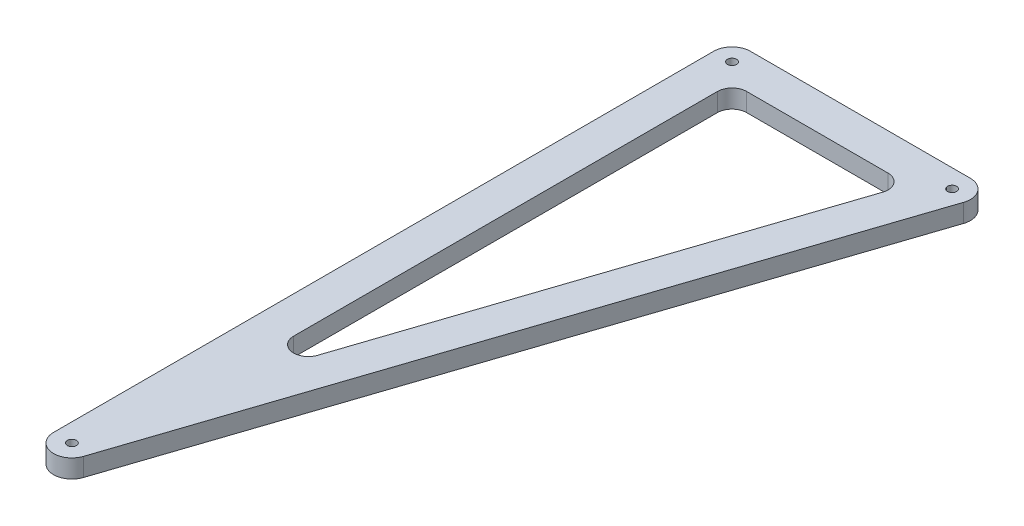
ISO-10303-21;
HEADER;
FILE_DESCRIPTION(('STEP AP214'),'2;1');
FILE_NAME('part.step','',(''),(''),'','','');
FILE_SCHEMA(('AUTOMOTIVE_DESIGN { 1 0 10303 214 1 1 1 1 }'));
ENDSEC;
DATA;
#1=APPLICATION_CONTEXT('core data for automotive mechanical design processes');
#2=APPLICATION_PROTOCOL_DEFINITION('international standard','automotive_design',2000,#1);
#3=PRODUCT_CONTEXT('',#1,'mechanical');
#4=PRODUCT('Part','Part','',(#3));
#5=PRODUCT_RELATED_PRODUCT_CATEGORY('part','',(#4));
#6=PRODUCT_DEFINITION_FORMATION('','',#4);
#7=PRODUCT_DEFINITION_CONTEXT('part definition',#1,'design');
#8=PRODUCT_DEFINITION('design','',#6,#7);
#9=PRODUCT_DEFINITION_SHAPE('','',#8);
#10=(LENGTH_UNIT() NAMED_UNIT(*) SI_UNIT(.MILLI.,.METRE.));
#11=(NAMED_UNIT(*) PLANE_ANGLE_UNIT() SI_UNIT($,.RADIAN.));
#12=(NAMED_UNIT(*) SI_UNIT($,.STERADIAN.) SOLID_ANGLE_UNIT());
#13=UNCERTAINTY_MEASURE_WITH_UNIT(LENGTH_MEASURE(1.E-05),#10,'distance_accuracy_value','');
#14=(GEOMETRIC_REPRESENTATION_CONTEXT(3) GLOBAL_UNCERTAINTY_ASSIGNED_CONTEXT((#13)) GLOBAL_UNIT_ASSIGNED_CONTEXT((#10,
#11,#12)) REPRESENTATION_CONTEXT('',''));
#15=CARTESIAN_POINT('',(0.,0.,0.));
#16=DIRECTION('',(0.,0.,1.));
#17=DIRECTION('',(1.,0.,0.));
#18=AXIS2_PLACEMENT_3D('',#15,#16,#17);
#19=CARTESIAN_POINT('',(0.,3.175,0.));
#20=DIRECTION('',(0.,-1.,0.));
#21=DIRECTION('',(0.,0.,-1.));
#22=AXIS2_PLACEMENT_3D('',#19,#20,#21);
#23=PLANE('',#22);
#24=CARTESIAN_POINT('',(0.,3.175,0.));
#25=DIRECTION('',(0.,1.,0.));
#26=DIRECTION('',(0.,0.,1.));
#27=AXIS2_PLACEMENT_3D('',#24,#25,#26);
#28=CIRCLE('',#27,0.7874);
#29=CARTESIAN_POINT('',(0.,3.175,0.7874));
#30=VERTEX_POINT('',#29);
#31=EDGE_CURVE('E204',#30,#30,#28,.T.);
#32=ORIENTED_EDGE('',*,*,#31,.F.);
#33=EDGE_LOOP('',(#32));
#34=FACE_BOUND('',#33,.T.);
#35=CARTESIAN_POINT('',(38.1,3.175,-114.3));
#36=DIRECTION('',(0.,1.,0.));
#37=DIRECTION('',(0.,0.,1.));
#38=AXIS2_PLACEMENT_3D('',#35,#36,#37);
#39=CIRCLE('',#38,0.787399999999999);
#40=CARTESIAN_POINT('',(38.1,3.175,-113.5126));
#41=VERTEX_POINT('',#40);
#42=EDGE_CURVE('E212',#41,#41,#39,.T.);
#43=ORIENTED_EDGE('',*,*,#42,.F.);
#44=EDGE_LOOP('',(#43));
#45=FACE_BOUND('',#44,.T.);
#46=CARTESIAN_POINT('',(0.,3.175,-114.3));
#47=DIRECTION('',(0.,1.,0.));
#48=DIRECTION('',(0.,0.,1.));
#49=AXIS2_PLACEMENT_3D('',#46,#47,#48);
#50=CIRCLE('',#49,0.7874);
#51=CARTESIAN_POINT('',(0.,3.175,-113.5126));
#52=VERTEX_POINT('',#51);
#53=EDGE_CURVE('E220',#52,#52,#50,.T.);
#54=ORIENTED_EDGE('',*,*,#53,.F.);
#55=EDGE_LOOP('',(#54));
#56=FACE_BOUND('',#55,.T.);
#57=CARTESIAN_POINT('',(0.,3.175,0.));
#58=DIRECTION('',(0.,1.,0.));
#59=DIRECTION('',(0.,0.,-1.));
#60=AXIS2_PLACEMENT_3D('',#57,#58,#59);
#61=CIRCLE('',#60,3.175);
#62=CARTESIAN_POINT('',(-3.175,3.175,0.));
#63=VERTEX_POINT('',#62);
#64=CARTESIAN_POINT('',(3.01206947131038,3.175,1.00402315710346));
#65=VERTEX_POINT('',#64);
#66=EDGE_CURVE('E228',#63,#65,#61,.T.);
#67=ORIENTED_EDGE('',*,*,#66,.T.);
#68=DIRECTION('',(0.316227766016838,0.,-0.948683298050514));
#69=VECTOR('',#68,1.);
#70=CARTESIAN_POINT('',(41.1120694713104,3.175,-113.295976842897));
#71=LINE('',#70,#69);
#72=CARTESIAN_POINT('',(41.1120694713104,3.175,-113.295976842897));
#73=VERTEX_POINT('',#72);
#74=EDGE_CURVE('E232',#65,#73,#71,.T.);
#75=ORIENTED_EDGE('',*,*,#74,.T.);
#76=CARTESIAN_POINT('',(38.1,3.175,-114.3));
#77=DIRECTION('',(0.,1.,0.));
#78=DIRECTION('',(0.,0.,-1.));
#79=AXIS2_PLACEMENT_3D('',#76,#77,#78);
#80=CIRCLE('',#79,3.17499999999999);
#81=CARTESIAN_POINT('',(38.1,3.175,-117.475));
#82=VERTEX_POINT('',#81);
#83=EDGE_CURVE('E236',#73,#82,#80,.T.);
#84=ORIENTED_EDGE('',*,*,#83,.T.);
#85=DIRECTION('',(-1.,0.,0.));
#86=VECTOR('',#85,1.);
#87=CARTESIAN_POINT('',(0.,3.175,-117.475));
#88=LINE('',#87,#86);
#89=CARTESIAN_POINT('',(0.,3.175,-117.475));
#90=VERTEX_POINT('',#89);
#91=EDGE_CURVE('E239',#82,#90,#88,.T.);
#92=ORIENTED_EDGE('',*,*,#91,.T.);
#93=CARTESIAN_POINT('',(0.,3.175,-114.3));
#94=DIRECTION('',(0.,1.,0.));
#95=DIRECTION('',(0.,0.,-1.));
#96=AXIS2_PLACEMENT_3D('',#93,#94,#95);
#97=CIRCLE('',#96,3.175);
#98=CARTESIAN_POINT('',(-3.175,3.175,-114.3));
#99=VERTEX_POINT('',#98);
#100=EDGE_CURVE('E242',#90,#99,#97,.T.);
#101=ORIENTED_EDGE('',*,*,#100,.T.);
#102=DIRECTION('',(0.,0.,1.));
#103=VECTOR('',#102,1.);
#104=CARTESIAN_POINT('',(-3.175,3.175,0.));
#105=LINE('',#104,#103);
#106=EDGE_CURVE('E245',#99,#63,#105,.T.);
#107=ORIENTED_EDGE('',*,*,#106,.T.);
#108=EDGE_LOOP('',(#67,#75,#84,#92,#101,#107));
#109=FACE_BOUND('',#108,.T.);
#110=CARTESIAN_POINT('',(30.1708610573792,3.175,-108.585));
#111=DIRECTION('',(0.,1.,0.));
#112=DIRECTION('',(0.,0.,-1.));
#113=AXIS2_PLACEMENT_3D('',#110,#111,#112);
#114=CIRCLE('',#113,2.54);
#115=CARTESIAN_POINT('',(32.5805166344275,3.175,-107.781781474317));
#116=VERTEX_POINT('',#115);
#117=CARTESIAN_POINT('',(30.1708610573792,3.175,-111.125));
#118=VERTEX_POINT('',#117);
#119=EDGE_CURVE('E135',#116,#118,#114,.T.);
#120=ORIENTED_EDGE('',*,*,#119,.F.);
#121=DIRECTION('',(0.316227766016838,0.,-0.948683298050514));
#122=VECTOR('',#121,1.);
#123=CARTESIAN_POINT('',(8.12465557704831,3.175,-34.4141983021795));
#124=LINE('',#123,#122);
#125=CARTESIAN_POINT('',(8.12465557704831,3.175,-34.4141983021795));
#126=VERTEX_POINT('',#125);
#127=EDGE_CURVE('E170',#126,#116,#124,.T.);
#128=ORIENTED_EDGE('',*,*,#127,.F.);
#129=CARTESIAN_POINT('',(5.71500000000001,3.175,-35.2174168278623));
#130=DIRECTION('',(0.,1.,0.));
#131=DIRECTION('',(0.,0.,1.));
#132=AXIS2_PLACEMENT_3D('',#129,#130,#131);
#133=CIRCLE('',#132,2.54);
#134=CARTESIAN_POINT('',(3.17500000000001,3.175,-35.2174168278623));
#135=VERTEX_POINT('',#134);
#136=EDGE_CURVE('E167',#135,#126,#133,.T.);
#137=ORIENTED_EDGE('',*,*,#136,.F.);
#138=DIRECTION('',(0.,0.,1.));
#139=VECTOR('',#138,1.);
#140=CARTESIAN_POINT('',(3.175,3.175,-108.585));
#141=LINE('',#140,#139);
#142=CARTESIAN_POINT('',(3.175,3.175,-108.585));
#143=VERTEX_POINT('',#142);
#144=EDGE_CURVE('E162',#143,#135,#141,.T.);
#145=ORIENTED_EDGE('',*,*,#144,.F.);
#146=CARTESIAN_POINT('',(5.715,3.175,-108.585));
#147=DIRECTION('',(0.,1.,0.));
#148=DIRECTION('',(0.,0.,1.));
#149=AXIS2_PLACEMENT_3D('',#146,#147,#148);
#150=CIRCLE('',#149,2.54);
#151=CARTESIAN_POINT('',(5.715,3.175,-111.125));
#152=VERTEX_POINT('',#151);
#153=EDGE_CURVE('E158',#152,#143,#150,.T.);
#154=ORIENTED_EDGE('',*,*,#153,.F.);
#155=DIRECTION('',(-1.,0.,0.));
#156=VECTOR('',#155,1.);
#157=CARTESIAN_POINT('',(30.1708610573792,3.175,-111.125));
#158=LINE('',#157,#156);
#159=EDGE_CURVE('E144',#118,#152,#158,.T.);
#160=ORIENTED_EDGE('',*,*,#159,.F.);
#161=EDGE_LOOP('',(#120,#128,#137,#145,#154,#160));
#162=FACE_BOUND('',#161,.T.);
#163=ADVANCED_FACE('F45',(#34,#45,#56,#109,#162),#23,.F.);
#164=CARTESIAN_POINT('',(0.,0.,0.));
#165=DIRECTION('',(0.,-1.,0.));
#166=DIRECTION('',(0.,0.,-1.));
#167=AXIS2_PLACEMENT_3D('',#164,#165,#166);
#168=PLANE('',#167);
#169=CARTESIAN_POINT('',(38.1,0.,-114.3));
#170=DIRECTION('',(0.,1.,0.));
#171=DIRECTION('',(0.,0.,1.));
#172=AXIS2_PLACEMENT_3D('',#169,#170,#171);
#173=CIRCLE('',#172,0.787399999999999);
#174=CARTESIAN_POINT('',(38.1,0.,-113.5126));
#175=VERTEX_POINT('',#174);
#176=EDGE_CURVE('E208',#175,#175,#173,.T.);
#177=ORIENTED_EDGE('',*,*,#176,.T.);
#178=EDGE_LOOP('',(#177));
#179=FACE_BOUND('',#178,.T.);
#180=CARTESIAN_POINT('',(0.,0.,0.));
#181=DIRECTION('',(0.,1.,0.));
#182=DIRECTION('',(0.,0.,-1.));
#183=AXIS2_PLACEMENT_3D('',#180,#181,#182);
#184=CIRCLE('',#183,3.175);
#185=CARTESIAN_POINT('',(-3.175,0.,0.));
#186=VERTEX_POINT('',#185);
#187=CARTESIAN_POINT('',(3.01206947131038,0.,1.00402315710346));
#188=VERTEX_POINT('',#187);
#189=EDGE_CURVE('E224',#186,#188,#184,.T.);
#190=ORIENTED_EDGE('',*,*,#189,.F.);
#191=DIRECTION('',(0.,0.,1.));
#192=VECTOR('',#191,1.);
#193=CARTESIAN_POINT('',(-3.175,0.,0.));
#194=LINE('',#193,#192);
#195=CARTESIAN_POINT('',(-3.175,0.,-114.3));
#196=VERTEX_POINT('',#195);
#197=EDGE_CURVE('E233',#196,#186,#194,.T.);
#198=ORIENTED_EDGE('',*,*,#197,.F.);
#199=CARTESIAN_POINT('',(0.,0.,-114.3));
#200=DIRECTION('',(0.,1.,0.));
#201=DIRECTION('',(0.,0.,-1.));
#202=AXIS2_PLACEMENT_3D('',#199,#200,#201);
#203=CIRCLE('',#202,3.175);
#204=CARTESIAN_POINT('',(0.,0.,-117.475));
#205=VERTEX_POINT('',#204);
#206=EDGE_CURVE('E261',#205,#196,#203,.T.);
#207=ORIENTED_EDGE('',*,*,#206,.F.);
#208=DIRECTION('',(-1.,0.,0.));
#209=VECTOR('',#208,1.);
#210=CARTESIAN_POINT('',(0.,0.,-117.475));
#211=LINE('',#210,#209);
#212=CARTESIAN_POINT('',(38.1,0.,-117.475));
#213=VERTEX_POINT('',#212);
#214=EDGE_CURVE('E258',#213,#205,#211,.T.);
#215=ORIENTED_EDGE('',*,*,#214,.F.);
#216=CARTESIAN_POINT('',(38.1,0.,-114.3));
#217=DIRECTION('',(0.,1.,0.));
#218=DIRECTION('',(0.,0.,-1.));
#219=AXIS2_PLACEMENT_3D('',#216,#217,#218);
#220=CIRCLE('',#219,3.17499999999999);
#221=CARTESIAN_POINT('',(41.1120694713104,0.,-113.295976842897));
#222=VERTEX_POINT('',#221);
#223=EDGE_CURVE('E255',#222,#213,#220,.T.);
#224=ORIENTED_EDGE('',*,*,#223,.F.);
#225=DIRECTION('',(0.316227766016838,0.,-0.948683298050514));
#226=VECTOR('',#225,1.);
#227=CARTESIAN_POINT('',(41.1120694713104,0.,-113.295976842897));
#228=LINE('',#227,#226);
#229=EDGE_CURVE('E252',#188,#222,#228,.T.);
#230=ORIENTED_EDGE('',*,*,#229,.F.);
#231=EDGE_LOOP('',(#190,#198,#207,#215,#224,#230));
#232=FACE_BOUND('',#231,.T.);
#233=CARTESIAN_POINT('',(0.,0.,-114.3));
#234=DIRECTION('',(0.,1.,0.));
#235=DIRECTION('',(0.,0.,1.));
#236=AXIS2_PLACEMENT_3D('',#233,#234,#235);
#237=CIRCLE('',#236,0.7874);
#238=CARTESIAN_POINT('',(0.,0.,-113.5126));
#239=VERTEX_POINT('',#238);
#240=EDGE_CURVE('E216',#239,#239,#237,.T.);
#241=ORIENTED_EDGE('',*,*,#240,.T.);
#242=EDGE_LOOP('',(#241));
#243=FACE_BOUND('',#242,.T.);
#244=CARTESIAN_POINT('',(0.,0.,0.));
#245=DIRECTION('',(0.,1.,0.));
#246=DIRECTION('',(0.,0.,1.));
#247=AXIS2_PLACEMENT_3D('',#244,#245,#246);
#248=CIRCLE('',#247,0.7874);
#249=CARTESIAN_POINT('',(0.,0.,0.7874));
#250=VERTEX_POINT('',#249);
#251=EDGE_CURVE('E153',#250,#250,#248,.T.);
#252=ORIENTED_EDGE('',*,*,#251,.T.);
#253=EDGE_LOOP('',(#252));
#254=FACE_BOUND('',#253,.T.);
#255=DIRECTION('',(0.316227766016838,0.,-0.948683298050514));
#256=VECTOR('',#255,1.);
#257=CARTESIAN_POINT('',(8.12465557704831,0.,-34.4141983021795));
#258=LINE('',#257,#256);
#259=CARTESIAN_POINT('',(8.12465557704831,0.,-34.4141983021795));
#260=VERTEX_POINT('',#259);
#261=CARTESIAN_POINT('',(32.5805166344275,0.,-107.781781474317));
#262=VERTEX_POINT('',#261);
#263=EDGE_CURVE('E145',#260,#262,#258,.T.);
#264=ORIENTED_EDGE('',*,*,#263,.T.);
#265=CARTESIAN_POINT('',(30.1708610573792,0.,-108.585));
#266=DIRECTION('',(0.,1.,0.));
#267=DIRECTION('',(0.,0.,-1.));
#268=AXIS2_PLACEMENT_3D('',#265,#266,#267);
#269=CIRCLE('',#268,2.54);
#270=CARTESIAN_POINT('',(30.1708610573792,0.,-111.125));
#271=VERTEX_POINT('',#270);
#272=EDGE_CURVE('E69',#262,#271,#269,.T.);
#273=ORIENTED_EDGE('',*,*,#272,.T.);
#274=DIRECTION('',(-1.,0.,0.));
#275=VECTOR('',#274,1.);
#276=CARTESIAN_POINT('',(30.1708610573792,0.,-111.125));
#277=LINE('',#276,#275);
#278=CARTESIAN_POINT('',(5.715,0.,-111.125));
#279=VERTEX_POINT('',#278);
#280=EDGE_CURVE('E151',#271,#279,#277,.T.);
#281=ORIENTED_EDGE('',*,*,#280,.T.);
#282=CARTESIAN_POINT('',(5.715,0.,-108.585));
#283=DIRECTION('',(0.,1.,0.));
#284=DIRECTION('',(0.,0.,1.));
#285=AXIS2_PLACEMENT_3D('',#282,#283,#284);
#286=CIRCLE('',#285,2.54);
#287=CARTESIAN_POINT('',(3.175,0.,-108.585));
#288=VERTEX_POINT('',#287);
#289=EDGE_CURVE('E177',#279,#288,#286,.T.);
#290=ORIENTED_EDGE('',*,*,#289,.T.);
#291=DIRECTION('',(0.,0.,1.));
#292=VECTOR('',#291,1.);
#293=CARTESIAN_POINT('',(3.175,0.,-108.585));
#294=LINE('',#293,#292);
#295=CARTESIAN_POINT('',(3.17500000000001,0.,-35.2174168278623));
#296=VERTEX_POINT('',#295);
#297=EDGE_CURVE('E181',#288,#296,#294,.T.);
#298=ORIENTED_EDGE('',*,*,#297,.T.);
#299=CARTESIAN_POINT('',(5.71500000000001,0.,-35.2174168278623));
#300=DIRECTION('',(0.,1.,0.));
#301=DIRECTION('',(0.,0.,1.));
#302=AXIS2_PLACEMENT_3D('',#299,#300,#301);
#303=CIRCLE('',#302,2.54);
#304=EDGE_CURVE('E185',#296,#260,#303,.T.);
#305=ORIENTED_EDGE('',*,*,#304,.T.);
#306=EDGE_LOOP('',(#264,#273,#281,#290,#298,#305));
#307=FACE_BOUND('',#306,.T.);
#308=ADVANCED_FACE('F292',(#179,#232,#243,#254,#307),#168,.T.);
#309=CARTESIAN_POINT('',(0.,3.175,0.));
#310=DIRECTION('',(0.,-1.,0.));
#311=DIRECTION('',(0.,0.,-1.));
#312=AXIS2_PLACEMENT_3D('',#309,#310,#311);
#313=CYLINDRICAL_SURFACE('',#312,3.175);
#314=ORIENTED_EDGE('',*,*,#189,.T.);
#315=DIRECTION('',(0.,-1.,0.));
#316=VECTOR('',#315,1.);
#317=CARTESIAN_POINT('',(3.01206947131038,3.175,1.00402315710346));
#318=LINE('',#317,#316);
#319=EDGE_CURVE('E11',#65,#188,#318,.T.);
#320=ORIENTED_EDGE('',*,*,#319,.F.);
#321=ORIENTED_EDGE('',*,*,#66,.F.);
#322=DIRECTION('',(0.,-1.,0.));
#323=VECTOR('',#322,1.);
#324=CARTESIAN_POINT('',(-3.175,3.175,0.));
#325=LINE('',#324,#323);
#326=EDGE_CURVE('E248',#63,#186,#325,.T.);
#327=ORIENTED_EDGE('',*,*,#326,.T.);
#328=EDGE_LOOP('',(#314,#320,#321,#327));
#329=FACE_BOUND('',#328,.T.);
#330=ADVANCED_FACE('F47',(#329),#313,.T.);
#331=CARTESIAN_POINT('',(41.1120694713104,3.175,-113.295976842897));
#332=DIRECTION('',(-0.948683298050514,0.,-0.316227766016838));
#333=DIRECTION('',(-0.316227766016838,0.,0.948683298050514));
#334=AXIS2_PLACEMENT_3D('',#331,#332,#333);
#335=PLANE('',#334);
#336=ORIENTED_EDGE('',*,*,#229,.T.);
#337=DIRECTION('',(0.,-1.,0.));
#338=VECTOR('',#337,1.);
#339=CARTESIAN_POINT('',(41.1120694713104,3.175,-113.295976842897));
#340=LINE('',#339,#338);
#341=EDGE_CURVE('E54',#73,#222,#340,.T.);
#342=ORIENTED_EDGE('',*,*,#341,.F.);
#343=ORIENTED_EDGE('',*,*,#74,.F.);
#344=ORIENTED_EDGE('',*,*,#319,.T.);
#345=EDGE_LOOP('',(#336,#342,#343,#344));
#346=FACE_BOUND('',#345,.T.);
#347=ADVANCED_FACE('F309',(#346),#335,.F.);
#348=CARTESIAN_POINT('',(38.1,3.175,-114.3));
#349=DIRECTION('',(0.,-1.,0.));
#350=DIRECTION('',(0.,0.,-1.));
#351=AXIS2_PLACEMENT_3D('',#348,#349,#350);
#352=CYLINDRICAL_SURFACE('',#351,3.17499999999999);
#353=ORIENTED_EDGE('',*,*,#223,.T.);
#354=DIRECTION('',(0.,-1.,0.));
#355=VECTOR('',#354,1.);
#356=CARTESIAN_POINT('',(38.1,3.175,-117.475));
#357=LINE('',#356,#355);
#358=EDGE_CURVE('E277',#82,#213,#357,.T.);
#359=ORIENTED_EDGE('',*,*,#358,.F.);
#360=ORIENTED_EDGE('',*,*,#83,.F.);
#361=ORIENTED_EDGE('',*,*,#341,.T.);
#362=EDGE_LOOP('',(#353,#359,#360,#361));
#363=FACE_BOUND('',#362,.T.);
#364=ADVANCED_FACE('F286',(#363),#352,.T.);
#365=CARTESIAN_POINT('',(0.,3.175,-117.475));
#366=DIRECTION('',(0.,0.,1.));
#367=DIRECTION('',(1.,0.,0.));
#368=AXIS2_PLACEMENT_3D('',#365,#366,#367);
#369=PLANE('',#368);
#370=ORIENTED_EDGE('',*,*,#214,.T.);
#371=DIRECTION('',(0.,-1.,0.));
#372=VECTOR('',#371,1.);
#373=CARTESIAN_POINT('',(0.,3.175,-117.475));
#374=LINE('',#373,#372);
#375=EDGE_CURVE('E273',#90,#205,#374,.T.);
#376=ORIENTED_EDGE('',*,*,#375,.F.);
#377=ORIENTED_EDGE('',*,*,#91,.F.);
#378=ORIENTED_EDGE('',*,*,#358,.T.);
#379=EDGE_LOOP('',(#370,#376,#377,#378));
#380=FACE_BOUND('',#379,.T.);
#381=ADVANCED_FACE('F298',(#380),#369,.F.);
#382=CARTESIAN_POINT('',(0.,3.175,-114.3));
#383=DIRECTION('',(0.,-1.,0.));
#384=DIRECTION('',(0.,0.,-1.));
#385=AXIS2_PLACEMENT_3D('',#382,#383,#384);
#386=CYLINDRICAL_SURFACE('',#385,3.175);
#387=ORIENTED_EDGE('',*,*,#206,.T.);
#388=DIRECTION('',(0.,-1.,0.));
#389=VECTOR('',#388,1.);
#390=CARTESIAN_POINT('',(-3.175,3.175,-114.3));
#391=LINE('',#390,#389);
#392=EDGE_CURVE('E269',#99,#196,#391,.T.);
#393=ORIENTED_EDGE('',*,*,#392,.F.);
#394=ORIENTED_EDGE('',*,*,#100,.F.);
#395=ORIENTED_EDGE('',*,*,#375,.T.);
#396=EDGE_LOOP('',(#387,#393,#394,#395));
#397=FACE_BOUND('',#396,.T.);
#398=ADVANCED_FACE('F302',(#397),#386,.T.);
#399=CARTESIAN_POINT('',(-3.175,3.175,0.));
#400=DIRECTION('',(1.,0.,0.));
#401=DIRECTION('',(0.,0.,-1.));
#402=AXIS2_PLACEMENT_3D('',#399,#400,#401);
#403=PLANE('',#402);
#404=ORIENTED_EDGE('',*,*,#197,.T.);
#405=ORIENTED_EDGE('',*,*,#326,.F.);
#406=ORIENTED_EDGE('',*,*,#106,.F.);
#407=ORIENTED_EDGE('',*,*,#392,.T.);
#408=EDGE_LOOP('',(#404,#405,#406,#407));
#409=FACE_BOUND('',#408,.T.);
#410=ADVANCED_FACE('F312',(#409),#403,.F.);
#411=CARTESIAN_POINT('',(0.,3.175,-114.3));
#412=DIRECTION('',(0.,-1.,0.));
#413=DIRECTION('',(0.,0.,-1.));
#414=AXIS2_PLACEMENT_3D('',#411,#412,#413);
#415=CYLINDRICAL_SURFACE('',#414,0.7874);
#416=ORIENTED_EDGE('',*,*,#53,.T.);
#417=EDGE_LOOP('',(#416));
#418=FACE_BOUND('',#417,.T.);
#419=ORIENTED_EDGE('',*,*,#240,.F.);
#420=EDGE_LOOP('',(#419));
#421=FACE_BOUND('',#420,.T.);
#422=ADVANCED_FACE('F314',(#418,#421),#415,.F.);
#423=CARTESIAN_POINT('',(38.1,3.175,-114.3));
#424=DIRECTION('',(0.,-1.,0.));
#425=DIRECTION('',(0.,0.,-1.));
#426=AXIS2_PLACEMENT_3D('',#423,#424,#425);
#427=CYLINDRICAL_SURFACE('',#426,0.787399999999999);
#428=ORIENTED_EDGE('',*,*,#42,.T.);
#429=EDGE_LOOP('',(#428));
#430=FACE_BOUND('',#429,.T.);
#431=ORIENTED_EDGE('',*,*,#176,.F.);
#432=EDGE_LOOP('',(#431));
#433=FACE_BOUND('',#432,.T.);
#434=ADVANCED_FACE('F320',(#430,#433),#427,.F.);
#435=CARTESIAN_POINT('',(0.,3.175,0.));
#436=DIRECTION('',(0.,-1.,0.));
#437=DIRECTION('',(0.,0.,-1.));
#438=AXIS2_PLACEMENT_3D('',#435,#436,#437);
#439=CYLINDRICAL_SURFACE('',#438,0.7874);
#440=ORIENTED_EDGE('',*,*,#31,.T.);
#441=EDGE_LOOP('',(#440));
#442=FACE_BOUND('',#441,.T.);
#443=ORIENTED_EDGE('',*,*,#251,.F.);
#444=EDGE_LOOP('',(#443));
#445=FACE_BOUND('',#444,.T.);
#446=ADVANCED_FACE('F337',(#442,#445),#439,.F.);
#447=CARTESIAN_POINT('',(30.1708610573792,3.175,-108.585));
#448=DIRECTION('',(0.,-1.,0.));
#449=DIRECTION('',(0.,0.,-1.));
#450=AXIS2_PLACEMENT_3D('',#447,#448,#449);
#451=CYLINDRICAL_SURFACE('',#450,2.54);
#452=ORIENTED_EDGE('',*,*,#272,.F.);
#453=DIRECTION('',(0.,-1.,0.));
#454=VECTOR('',#453,1.);
#455=CARTESIAN_POINT('',(32.5805166344275,3.175,-107.781781474317));
#456=LINE('',#455,#454);
#457=EDGE_CURVE('E139',#116,#262,#456,.T.);
#458=ORIENTED_EDGE('',*,*,#457,.F.);
#459=ORIENTED_EDGE('',*,*,#119,.T.);
#460=DIRECTION('',(0.,-1.,0.));
#461=VECTOR('',#460,1.);
#462=CARTESIAN_POINT('',(30.1708610573792,3.175,-111.125));
#463=LINE('',#462,#461);
#464=EDGE_CURVE('E138',#118,#271,#463,.T.);
#465=ORIENTED_EDGE('',*,*,#464,.T.);
#466=EDGE_LOOP('',(#452,#458,#459,#465));
#467=FACE_BOUND('',#466,.T.);
#468=ADVANCED_FACE('F137',(#467),#451,.F.);
#469=CARTESIAN_POINT('',(30.1708610573792,3.175,-111.125));
#470=DIRECTION('',(0.,0.,1.));
#471=DIRECTION('',(1.,0.,0.));
#472=AXIS2_PLACEMENT_3D('',#469,#470,#471);
#473=PLANE('',#472);
#474=ORIENTED_EDGE('',*,*,#280,.F.);
#475=ORIENTED_EDGE('',*,*,#464,.F.);
#476=ORIENTED_EDGE('',*,*,#159,.T.);
#477=DIRECTION('',(0.,-1.,0.));
#478=VECTOR('',#477,1.);
#479=CARTESIAN_POINT('',(5.715,3.175,-111.125));
#480=LINE('',#479,#478);
#481=EDGE_CURVE('E154',#152,#279,#480,.T.);
#482=ORIENTED_EDGE('',*,*,#481,.T.);
#483=EDGE_LOOP('',(#474,#475,#476,#482));
#484=FACE_BOUND('',#483,.T.);
#485=ADVANCED_FACE('F148',(#484),#473,.T.);
#486=CARTESIAN_POINT('',(5.715,3.175,-108.585));
#487=DIRECTION('',(0.,-1.,0.));
#488=DIRECTION('',(0.,0.,-1.));
#489=AXIS2_PLACEMENT_3D('',#486,#487,#488);
#490=CYLINDRICAL_SURFACE('',#489,2.54);
#491=ORIENTED_EDGE('',*,*,#289,.F.);
#492=ORIENTED_EDGE('',*,*,#481,.F.);
#493=ORIENTED_EDGE('',*,*,#153,.T.);
#494=DIRECTION('',(0.,-1.,0.));
#495=VECTOR('',#494,1.);
#496=CARTESIAN_POINT('',(3.175,3.175,-108.585));
#497=LINE('',#496,#495);
#498=EDGE_CURVE('E199',#143,#288,#497,.T.);
#499=ORIENTED_EDGE('',*,*,#498,.T.);
#500=EDGE_LOOP('',(#491,#492,#493,#499));
#501=FACE_BOUND('',#500,.T.);
#502=ADVANCED_FACE('F346',(#501),#490,.F.);
#503=CARTESIAN_POINT('',(3.175,3.175,-108.585));
#504=DIRECTION('',(1.,0.,0.));
#505=DIRECTION('',(0.,0.,-1.));
#506=AXIS2_PLACEMENT_3D('',#503,#504,#505);
#507=PLANE('',#506);
#508=ORIENTED_EDGE('',*,*,#297,.F.);
#509=ORIENTED_EDGE('',*,*,#498,.F.);
#510=ORIENTED_EDGE('',*,*,#144,.T.);
#511=DIRECTION('',(0.,-1.,0.));
#512=VECTOR('',#511,1.);
#513=CARTESIAN_POINT('',(3.17500000000001,3.175,-35.2174168278623));
#514=LINE('',#513,#512);
#515=EDGE_CURVE('E196',#135,#296,#514,.T.);
#516=ORIENTED_EDGE('',*,*,#515,.T.);
#517=EDGE_LOOP('',(#508,#509,#510,#516));
#518=FACE_BOUND('',#517,.T.);
#519=ADVANCED_FACE('F349',(#518),#507,.T.);
#520=CARTESIAN_POINT('',(5.71500000000001,3.175,-35.2174168278623));
#521=DIRECTION('',(0.,-1.,0.));
#522=DIRECTION('',(0.,0.,-1.));
#523=AXIS2_PLACEMENT_3D('',#520,#521,#522);
#524=CYLINDRICAL_SURFACE('',#523,2.54);
#525=ORIENTED_EDGE('',*,*,#304,.F.);
#526=ORIENTED_EDGE('',*,*,#515,.F.);
#527=ORIENTED_EDGE('',*,*,#136,.T.);
#528=DIRECTION('',(0.,-1.,0.));
#529=VECTOR('',#528,1.);
#530=CARTESIAN_POINT('',(8.12465557704831,3.175,-34.4141983021795));
#531=LINE('',#530,#529);
#532=EDGE_CURVE('E61',#126,#260,#531,.T.);
#533=ORIENTED_EDGE('',*,*,#532,.T.);
#534=EDGE_LOOP('',(#525,#526,#527,#533));
#535=FACE_BOUND('',#534,.T.);
#536=ADVANCED_FACE('F353',(#535),#524,.F.);
#537=CARTESIAN_POINT('',(8.12465557704831,3.175,-34.4141983021795));
#538=DIRECTION('',(-0.948683298050514,0.,-0.316227766016838));
#539=DIRECTION('',(-0.316227766016838,0.,0.948683298050514));
#540=AXIS2_PLACEMENT_3D('',#537,#538,#539);
#541=PLANE('',#540);
#542=ORIENTED_EDGE('',*,*,#263,.F.);
#543=ORIENTED_EDGE('',*,*,#532,.F.);
#544=ORIENTED_EDGE('',*,*,#127,.T.);
#545=ORIENTED_EDGE('',*,*,#457,.T.);
#546=EDGE_LOOP('',(#542,#543,#544,#545));
#547=FACE_BOUND('',#546,.T.);
#548=ADVANCED_FACE('F357',(#547),#541,.T.);
#549=CLOSED_SHELL('',(#163,#308,#330,#347,#364,#381,#398,#410,#422,#434,#446,#468,#485,#502,
#519,#536,#548));
#550=MANIFOLD_SOLID_BREP('B2',#549);
#551=ADVANCED_BREP_SHAPE_REPRESENTATION('',(#18,#550),#14);
#552=SHAPE_DEFINITION_REPRESENTATION(#9,#551);
ENDSEC;
END-ISO-10303-21;
